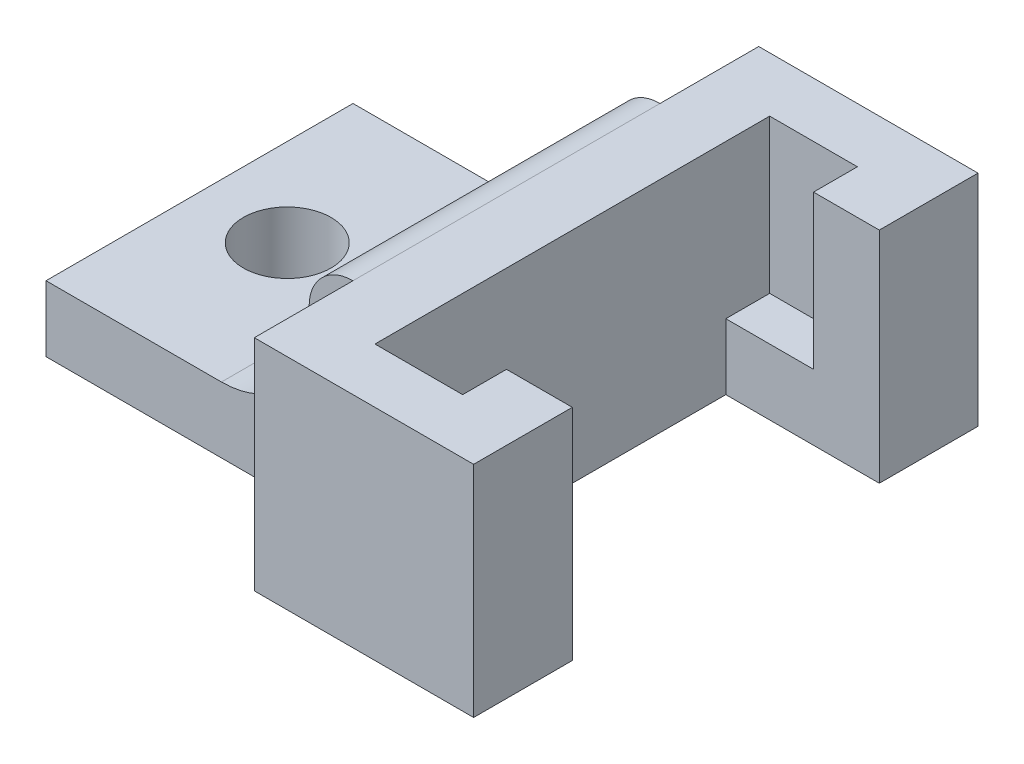
ISO-10303-21;
HEADER;
FILE_DESCRIPTION(('STEP AP214'),'2;1');
FILE_NAME('part.step','',(''),(''),'','','');
FILE_SCHEMA(('AUTOMOTIVE_DESIGN { 1 0 10303 214 1 1 1 1 }'));
ENDSEC;
DATA;
#1=APPLICATION_CONTEXT('core data for automotive mechanical design processes');
#2=APPLICATION_PROTOCOL_DEFINITION('international standard','automotive_design',2000,#1);
#3=PRODUCT_CONTEXT('',#1,'mechanical');
#4=PRODUCT('Part','Part','',(#3));
#5=PRODUCT_RELATED_PRODUCT_CATEGORY('part','',(#4));
#6=PRODUCT_DEFINITION_FORMATION('','',#4);
#7=PRODUCT_DEFINITION_CONTEXT('part definition',#1,'design');
#8=PRODUCT_DEFINITION('design','',#6,#7);
#9=PRODUCT_DEFINITION_SHAPE('','',#8);
#10=(LENGTH_UNIT() NAMED_UNIT(*) SI_UNIT(.MILLI.,.METRE.));
#11=(NAMED_UNIT(*) PLANE_ANGLE_UNIT() SI_UNIT($,.RADIAN.));
#12=(NAMED_UNIT(*) SI_UNIT($,.STERADIAN.) SOLID_ANGLE_UNIT());
#13=UNCERTAINTY_MEASURE_WITH_UNIT(LENGTH_MEASURE(1.E-05),#10,'distance_accuracy_value','');
#14=(GEOMETRIC_REPRESENTATION_CONTEXT(3) GLOBAL_UNCERTAINTY_ASSIGNED_CONTEXT((#13)) GLOBAL_UNIT_ASSIGNED_CONTEXT((#10,
#11,#12)) REPRESENTATION_CONTEXT('',''));
#15=CARTESIAN_POINT('',(0.,0.,0.));
#16=DIRECTION('',(0.,0.,1.));
#17=DIRECTION('',(1.,0.,0.));
#18=AXIS2_PLACEMENT_3D('',#15,#16,#17);
#19=CARTESIAN_POINT('',(0.,0.,0.));
#20=DIRECTION('',(0.,1.,0.));
#21=DIRECTION('',(0.,0.,1.));
#22=AXIS2_PLACEMENT_3D('',#19,#20,#21);
#23=PLANE('',#22);
#24=CARTESIAN_POINT('',(4.,0.,-7.));
#25=DIRECTION('',(0.,1.,0.));
#26=DIRECTION('',(0.,0.,1.));
#27=AXIS2_PLACEMENT_3D('',#24,#25,#26);
#28=CIRCLE('',#27,2.);
#29=CARTESIAN_POINT('',(4.,0.,-5.));
#30=VERTEX_POINT('',#29);
#31=EDGE_CURVE('E301',#30,#30,#28,.T.);
#32=ORIENTED_EDGE('',*,*,#31,.T.);
#33=EDGE_LOOP('',(#32));
#34=FACE_BOUND('',#33,.T.);
#35=DIRECTION('',(1.,0.,0.));
#36=VECTOR('',#35,1.);
#37=CARTESIAN_POINT('',(0.,0.,0.));
#38=LINE('',#37,#36);
#39=CARTESIAN_POINT('',(17.,0.,0.));
#40=VERTEX_POINT('',#39);
#41=CARTESIAN_POINT('',(24.,0.,0.));
#42=VERTEX_POINT('',#41);
#43=EDGE_CURVE('E297',#40,#42,#38,.T.);
#44=ORIENTED_EDGE('',*,*,#43,.T.);
#45=DIRECTION('',(0.,0.,1.));
#46=VECTOR('',#45,1.);
#47=CARTESIAN_POINT('',(24.,0.,0.));
#48=LINE('',#47,#46);
#49=CARTESIAN_POINT('',(24.,0.,4.5));
#50=VERTEX_POINT('',#49);
#51=EDGE_CURVE('E330',#42,#50,#48,.T.);
#52=ORIENTED_EDGE('',*,*,#51,.T.);
#53=DIRECTION('',(1.,0.,0.));
#54=VECTOR('',#53,1.);
#55=CARTESIAN_POINT('',(0.,0.,4.5));
#56=LINE('',#55,#54);
#57=CARTESIAN_POINT('',(14.,0.,4.5));
#58=VERTEX_POINT('',#57);
#59=EDGE_CURVE('E345',#58,#50,#56,.T.);
#60=ORIENTED_EDGE('',*,*,#59,.F.);
#61=DIRECTION('',(0.,0.,1.));
#62=VECTOR('',#61,1.);
#63=CARTESIAN_POINT('',(14.,0.,0.));
#64=LINE('',#63,#62);
#65=CARTESIAN_POINT('',(14.,0.,0.));
#66=VERTEX_POINT('',#65);
#67=EDGE_CURVE('E337',#66,#58,#64,.T.);
#68=ORIENTED_EDGE('',*,*,#67,.F.);
#69=DIRECTION('',(1.,0.,0.));
#70=VECTOR('',#69,1.);
#71=CARTESIAN_POINT('',(0.,0.,0.));
#72=LINE('',#71,#70);
#73=CARTESIAN_POINT('',(0.,0.,0.));
#74=VERTEX_POINT('',#73);
#75=EDGE_CURVE('E343',#74,#66,#72,.T.);
#76=ORIENTED_EDGE('',*,*,#75,.F.);
#77=DIRECTION('',(0.,0.,-1.));
#78=VECTOR('',#77,1.);
#79=CARTESIAN_POINT('',(0.,0.,0.));
#80=LINE('',#79,#78);
#81=CARTESIAN_POINT('',(0.,0.,-14.));
#82=VERTEX_POINT('',#81);
#83=EDGE_CURVE('E340',#74,#82,#80,.T.);
#84=ORIENTED_EDGE('',*,*,#83,.T.);
#85=DIRECTION('',(1.,0.,0.));
#86=VECTOR('',#85,1.);
#87=CARTESIAN_POINT('',(0.,0.,-14.));
#88=LINE('',#87,#86);
#89=CARTESIAN_POINT('',(14.,0.,-14.));
#90=VERTEX_POINT('',#89);
#91=EDGE_CURVE('E336',#82,#90,#88,.T.);
#92=ORIENTED_EDGE('',*,*,#91,.T.);
#93=CARTESIAN_POINT('',(14.,0.,-18.5));
#94=VERTEX_POINT('',#93);
#95=EDGE_CURVE('E333',#94,#90,#64,.T.);
#96=ORIENTED_EDGE('',*,*,#95,.F.);
#97=DIRECTION('',(1.,0.,0.));
#98=VECTOR('',#97,1.);
#99=CARTESIAN_POINT('',(0.,0.,-18.5));
#100=LINE('',#99,#98);
#101=CARTESIAN_POINT('',(24.,0.,-18.5));
#102=VERTEX_POINT('',#101);
#103=EDGE_CURVE('E329',#94,#102,#100,.T.);
#104=ORIENTED_EDGE('',*,*,#103,.T.);
#105=CARTESIAN_POINT('',(24.,0.,-14.));
#106=VERTEX_POINT('',#105);
#107=EDGE_CURVE('E326',#102,#106,#48,.T.);
#108=ORIENTED_EDGE('',*,*,#107,.T.);
#109=DIRECTION('',(1.,0.,0.));
#110=VECTOR('',#109,1.);
#111=CARTESIAN_POINT('',(0.,0.,-14.));
#112=LINE('',#111,#110);
#113=CARTESIAN_POINT('',(17.,0.,-14.));
#114=VERTEX_POINT('',#113);
#115=EDGE_CURVE('E323',#114,#106,#112,.T.);
#116=ORIENTED_EDGE('',*,*,#115,.F.);
#117=DIRECTION('',(0.,0.,1.));
#118=VECTOR('',#117,1.);
#119=CARTESIAN_POINT('',(17.,0.,0.));
#120=LINE('',#119,#118);
#121=EDGE_CURVE('E320',#114,#40,#120,.T.);
#122=ORIENTED_EDGE('',*,*,#121,.T.);
#123=EDGE_LOOP('',(#44,#52,#60,#68,#76,#84,#92,#96,#104,#108,#116,#122));
#124=FACE_BOUND('',#123,.T.);
#125=DIRECTION('',(-1.,0.,0.));
#126=VECTOR('',#125,1.);
#127=CARTESIAN_POINT('',(7.05,0.,-2.5));
#128=LINE('',#127,#126);
#129=CARTESIAN_POINT('',(11.05,0.,-2.5));
#130=VERTEX_POINT('',#129);
#131=CARTESIAN_POINT('',(7.05,0.,-2.5));
#132=VERTEX_POINT('',#131);
#133=EDGE_CURVE('E58',#130,#132,#128,.T.);
#134=ORIENTED_EDGE('',*,*,#133,.F.);
#135=DIRECTION('',(0.,0.,1.));
#136=VECTOR('',#135,1.);
#137=CARTESIAN_POINT('',(11.05,0.,-11.5));
#138=LINE('',#137,#136);
#139=CARTESIAN_POINT('',(11.05,0.,-11.5));
#140=VERTEX_POINT('',#139);
#141=EDGE_CURVE('E402',#130,#140,#138,.F.);
#142=ORIENTED_EDGE('',*,*,#141,.T.);
#143=DIRECTION('',(1.,0.,0.));
#144=VECTOR('',#143,1.);
#145=CARTESIAN_POINT('',(7.05,0.,-11.5));
#146=LINE('',#145,#144);
#147=CARTESIAN_POINT('',(7.05,0.,-11.5));
#148=VERTEX_POINT('',#147);
#149=EDGE_CURVE('E65',#148,#140,#146,.T.);
#150=ORIENTED_EDGE('',*,*,#149,.F.);
#151=DIRECTION('',(0.,0.,-1.));
#152=VECTOR('',#151,1.);
#153=CARTESIAN_POINT('',(7.05,0.,-2.5));
#154=LINE('',#153,#152);
#155=EDGE_CURVE('E407',#132,#148,#154,.T.);
#156=ORIENTED_EDGE('',*,*,#155,.F.);
#157=EDGE_LOOP('',(#134,#142,#150,#156));
#158=FACE_BOUND('',#157,.T.);
#159=ADVANCED_FACE('F43',(#34,#124,#158),#23,.F.);
#160=CARTESIAN_POINT('',(0.,10.,0.));
#161=DIRECTION('',(-1.,0.,0.));
#162=DIRECTION('',(0.,0.,1.));
#163=AXIS2_PLACEMENT_3D('',#160,#161,#162);
#164=PLANE('',#163);
#165=DIRECTION('',(0.,-1.,0.));
#166=VECTOR('',#165,1.);
#167=CARTESIAN_POINT('',(0.,10.,0.));
#168=LINE('',#167,#166);
#169=CARTESIAN_POINT('',(0.,3.,0.));
#170=VERTEX_POINT('',#169);
#171=EDGE_CURVE('E360',#170,#74,#168,.T.);
#172=ORIENTED_EDGE('',*,*,#171,.F.);
#173=DIRECTION('',(0.,0.,1.));
#174=VECTOR('',#173,1.);
#175=CARTESIAN_POINT('',(0.,3.,-14.));
#176=LINE('',#175,#174);
#177=CARTESIAN_POINT('',(0.,3.,-14.));
#178=VERTEX_POINT('',#177);
#179=EDGE_CURVE('E265',#178,#170,#176,.T.);
#180=ORIENTED_EDGE('',*,*,#179,.F.);
#181=DIRECTION('',(0.,-1.,0.));
#182=VECTOR('',#181,1.);
#183=CARTESIAN_POINT('',(0.,10.,-14.));
#184=LINE('',#183,#182);
#185=EDGE_CURVE('E362',#178,#82,#184,.T.);
#186=ORIENTED_EDGE('',*,*,#185,.T.);
#187=ORIENTED_EDGE('',*,*,#83,.F.);
#188=EDGE_LOOP('',(#172,#180,#186,#187));
#189=FACE_BOUND('',#188,.T.);
#190=ADVANCED_FACE('F428',(#189),#164,.T.);
#191=CARTESIAN_POINT('',(4.,10.,-7.));
#192=DIRECTION('',(0.,-1.,0.));
#193=DIRECTION('',(0.,0.,-1.));
#194=AXIS2_PLACEMENT_3D('',#191,#192,#193);
#195=CYLINDRICAL_SURFACE('',#194,2.);
#196=ORIENTED_EDGE('',*,*,#31,.F.);
#197=EDGE_LOOP('',(#196));
#198=FACE_BOUND('',#197,.T.);
#199=CARTESIAN_POINT('',(4.,3.,-7.));
#200=DIRECTION('',(0.,1.,0.));
#201=DIRECTION('',(0.,0.,1.));
#202=AXIS2_PLACEMENT_3D('',#199,#200,#201);
#203=CIRCLE('',#202,2.);
#204=CARTESIAN_POINT('',(4.,3.,-5.));
#205=VERTEX_POINT('',#204);
#206=EDGE_CURVE('E293',#205,#205,#203,.T.);
#207=ORIENTED_EDGE('',*,*,#206,.T.);
#208=EDGE_LOOP('',(#207));
#209=FACE_BOUND('',#208,.T.);
#210=ADVANCED_FACE('F436',(#198,#209),#195,.F.);
#211=CARTESIAN_POINT('',(0.,10.,0.));
#212=DIRECTION('',(0.,0.,-1.));
#213=DIRECTION('',(-1.,0.,0.));
#214=AXIS2_PLACEMENT_3D('',#211,#212,#213);
#215=PLANE('',#214);
#216=DIRECTION('',(0.,-1.,0.));
#217=VECTOR('',#216,1.);
#218=CARTESIAN_POINT('',(21.,10.,0.));
#219=LINE('',#218,#217);
#220=CARTESIAN_POINT('',(21.,10.,0.));
#221=VERTEX_POINT('',#220);
#222=CARTESIAN_POINT('',(21.,3.,0.));
#223=VERTEX_POINT('',#222);
#224=EDGE_CURVE('E291',#221,#223,#219,.T.);
#225=ORIENTED_EDGE('',*,*,#224,.F.);
#226=DIRECTION('',(1.,0.,0.));
#227=VECTOR('',#226,1.);
#228=CARTESIAN_POINT('',(0.,10.,0.));
#229=LINE('',#228,#227);
#230=CARTESIAN_POINT('',(24.,10.,0.));
#231=VERTEX_POINT('',#230);
#232=EDGE_CURVE('E298',#221,#231,#229,.T.);
#233=ORIENTED_EDGE('',*,*,#232,.T.);
#234=DIRECTION('',(0.,-1.,0.));
#235=VECTOR('',#234,1.);
#236=CARTESIAN_POINT('',(24.,10.,0.));
#237=LINE('',#236,#235);
#238=EDGE_CURVE('E350',#231,#42,#237,.T.);
#239=ORIENTED_EDGE('',*,*,#238,.T.);
#240=ORIENTED_EDGE('',*,*,#43,.F.);
#241=DIRECTION('',(0.,-1.,0.));
#242=VECTOR('',#241,1.);
#243=CARTESIAN_POINT('',(17.,10.,0.));
#244=LINE('',#243,#242);
#245=CARTESIAN_POINT('',(17.,3.,0.));
#246=VERTEX_POINT('',#245);
#247=EDGE_CURVE('E374',#246,#40,#244,.T.);
#248=ORIENTED_EDGE('',*,*,#247,.F.);
#249=DIRECTION('',(1.,0.,0.));
#250=VECTOR('',#249,1.);
#251=CARTESIAN_POINT('',(0.,3.,0.));
#252=LINE('',#251,#250);
#253=EDGE_CURVE('E294',#246,#223,#252,.T.);
#254=ORIENTED_EDGE('',*,*,#253,.T.);
#255=EDGE_LOOP('',(#225,#233,#239,#240,#248,#254));
#256=FACE_BOUND('',#255,.T.);
#257=ADVANCED_FACE('F446',(#256),#215,.T.);
#258=CARTESIAN_POINT('',(17.,10.,0.));
#259=DIRECTION('',(1.,0.,0.));
#260=DIRECTION('',(0.,0.,-1.));
#261=AXIS2_PLACEMENT_3D('',#258,#259,#260);
#262=PLANE('',#261);
#263=DIRECTION('',(0.,0.,1.));
#264=VECTOR('',#263,1.);
#265=CARTESIAN_POINT('',(17.,10.,0.));
#266=LINE('',#265,#264);
#267=CARTESIAN_POINT('',(17.,10.,-16.));
#268=VERTEX_POINT('',#267);
#269=CARTESIAN_POINT('',(17.,10.,2.));
#270=VERTEX_POINT('',#269);
#271=EDGE_CURVE('E300',#268,#270,#266,.T.);
#272=ORIENTED_EDGE('',*,*,#271,.T.);
#273=DIRECTION('',(0.,1.,0.));
#274=VECTOR('',#273,1.);
#275=CARTESIAN_POINT('',(17.,3.,2.));
#276=LINE('',#275,#274);
#277=CARTESIAN_POINT('',(17.,3.,2.));
#278=VERTEX_POINT('',#277);
#279=EDGE_CURVE('E274',#278,#270,#276,.T.);
#280=ORIENTED_EDGE('',*,*,#279,.F.);
#281=DIRECTION('',(0.,0.,1.));
#282=VECTOR('',#281,1.);
#283=CARTESIAN_POINT('',(17.,3.,-16.));
#284=LINE('',#283,#282);
#285=EDGE_CURVE('E255',#246,#278,#284,.T.);
#286=ORIENTED_EDGE('',*,*,#285,.F.);
#287=ORIENTED_EDGE('',*,*,#247,.T.);
#288=ORIENTED_EDGE('',*,*,#121,.F.);
#289=DIRECTION('',(0.,-1.,0.));
#290=VECTOR('',#289,1.);
#291=CARTESIAN_POINT('',(17.,10.,-14.));
#292=LINE('',#291,#290);
#293=CARTESIAN_POINT('',(17.,3.,-14.));
#294=VERTEX_POINT('',#293);
#295=EDGE_CURVE('E372',#294,#114,#292,.T.);
#296=ORIENTED_EDGE('',*,*,#295,.F.);
#297=CARTESIAN_POINT('',(17.,3.,-16.));
#298=VERTEX_POINT('',#297);
#299=EDGE_CURVE('E256',#298,#294,#284,.T.);
#300=ORIENTED_EDGE('',*,*,#299,.F.);
#301=DIRECTION('',(0.,1.,0.));
#302=VECTOR('',#301,1.);
#303=CARTESIAN_POINT('',(17.,3.,-16.));
#304=LINE('',#303,#302);
#305=EDGE_CURVE('E277',#298,#268,#304,.T.);
#306=ORIENTED_EDGE('',*,*,#305,.T.);
#307=EDGE_LOOP('',(#272,#280,#286,#287,#288,#296,#300,#306));
#308=FACE_BOUND('',#307,.T.);
#309=ADVANCED_FACE('F477',(#308),#262,.T.);
#310=CARTESIAN_POINT('',(0.,10.,-14.));
#311=DIRECTION('',(0.,0.,-1.));
#312=DIRECTION('',(-1.,0.,0.));
#313=AXIS2_PLACEMENT_3D('',#310,#311,#312);
#314=PLANE('',#313);
#315=DIRECTION('',(1.,0.,0.));
#316=VECTOR('',#315,1.);
#317=CARTESIAN_POINT('',(0.,10.,-14.));
#318=LINE('',#317,#316);
#319=CARTESIAN_POINT('',(21.,10.,-14.));
#320=VERTEX_POINT('',#319);
#321=CARTESIAN_POINT('',(24.,10.,-14.));
#322=VERTEX_POINT('',#321);
#323=EDGE_CURVE('E303',#320,#322,#318,.T.);
#324=ORIENTED_EDGE('',*,*,#323,.F.);
#325=DIRECTION('',(0.,-1.,0.));
#326=VECTOR('',#325,1.);
#327=CARTESIAN_POINT('',(21.,10.,-14.));
#328=LINE('',#327,#326);
#329=CARTESIAN_POINT('',(21.,3.,-14.));
#330=VERTEX_POINT('',#329);
#331=EDGE_CURVE('E273',#320,#330,#328,.T.);
#332=ORIENTED_EDGE('',*,*,#331,.T.);
#333=DIRECTION('',(1.,0.,0.));
#334=VECTOR('',#333,1.);
#335=CARTESIAN_POINT('',(0.,3.,-14.));
#336=LINE('',#335,#334);
#337=EDGE_CURVE('E379',#294,#330,#336,.T.);
#338=ORIENTED_EDGE('',*,*,#337,.F.);
#339=ORIENTED_EDGE('',*,*,#295,.T.);
#340=ORIENTED_EDGE('',*,*,#115,.T.);
#341=DIRECTION('',(0.,-1.,0.));
#342=VECTOR('',#341,1.);
#343=CARTESIAN_POINT('',(24.,10.,-14.));
#344=LINE('',#343,#342);
#345=EDGE_CURVE('E370',#322,#106,#344,.T.);
#346=ORIENTED_EDGE('',*,*,#345,.F.);
#347=EDGE_LOOP('',(#324,#332,#338,#339,#340,#346));
#348=FACE_BOUND('',#347,.T.);
#349=ADVANCED_FACE('F474',(#348),#314,.F.);
#350=CARTESIAN_POINT('',(24.,10.,0.));
#351=DIRECTION('',(1.,0.,0.));
#352=DIRECTION('',(0.,0.,-1.));
#353=AXIS2_PLACEMENT_3D('',#350,#351,#352);
#354=PLANE('',#353);
#355=ORIENTED_EDGE('',*,*,#107,.F.);
#356=DIRECTION('',(0.,-1.,0.));
#357=VECTOR('',#356,1.);
#358=CARTESIAN_POINT('',(24.,10.,-18.5));
#359=LINE('',#358,#357);
#360=CARTESIAN_POINT('',(24.,10.,-18.5));
#361=VERTEX_POINT('',#360);
#362=EDGE_CURVE('E368',#361,#102,#359,.T.);
#363=ORIENTED_EDGE('',*,*,#362,.F.);
#364=DIRECTION('',(0.,0.,1.));
#365=VECTOR('',#364,1.);
#366=CARTESIAN_POINT('',(24.,10.,0.));
#367=LINE('',#366,#365);
#368=EDGE_CURVE('E305',#361,#322,#367,.T.);
#369=ORIENTED_EDGE('',*,*,#368,.T.);
#370=ORIENTED_EDGE('',*,*,#345,.T.);
#371=EDGE_LOOP('',(#355,#363,#369,#370));
#372=FACE_BOUND('',#371,.T.);
#373=ADVANCED_FACE('F453',(#372),#354,.T.);
#374=CARTESIAN_POINT('',(0.,10.,-18.5));
#375=DIRECTION('',(0.,0.,-1.));
#376=DIRECTION('',(-1.,0.,0.));
#377=AXIS2_PLACEMENT_3D('',#374,#375,#376);
#378=PLANE('',#377);
#379=ORIENTED_EDGE('',*,*,#103,.F.);
#380=DIRECTION('',(0.,-1.,0.));
#381=VECTOR('',#380,1.);
#382=CARTESIAN_POINT('',(14.,10.,-18.5));
#383=LINE('',#382,#381);
#384=CARTESIAN_POINT('',(14.,10.,-18.5));
#385=VERTEX_POINT('',#384);
#386=EDGE_CURVE('E366',#385,#94,#383,.T.);
#387=ORIENTED_EDGE('',*,*,#386,.F.);
#388=DIRECTION('',(1.,0.,0.));
#389=VECTOR('',#388,1.);
#390=CARTESIAN_POINT('',(0.,10.,-18.5));
#391=LINE('',#390,#389);
#392=EDGE_CURVE('E308',#385,#361,#391,.T.);
#393=ORIENTED_EDGE('',*,*,#392,.T.);
#394=ORIENTED_EDGE('',*,*,#362,.T.);
#395=EDGE_LOOP('',(#379,#387,#393,#394));
#396=FACE_BOUND('',#395,.T.);
#397=ADVANCED_FACE('F470',(#396),#378,.T.);
#398=CARTESIAN_POINT('',(14.,10.,0.));
#399=DIRECTION('',(1.,0.,0.));
#400=DIRECTION('',(0.,0.,-1.));
#401=AXIS2_PLACEMENT_3D('',#398,#399,#400);
#402=PLANE('',#401);
#403=ORIENTED_EDGE('',*,*,#95,.T.);
#404=DIRECTION('',(0.,-1.,0.));
#405=VECTOR('',#404,1.);
#406=CARTESIAN_POINT('',(14.,10.,-14.));
#407=LINE('',#406,#405);
#408=CARTESIAN_POINT('',(14.,10.,-14.));
#409=VERTEX_POINT('',#408);
#410=EDGE_CURVE('E364',#409,#90,#407,.T.);
#411=ORIENTED_EDGE('',*,*,#410,.F.);
#412=DIRECTION('',(0.,0.,1.));
#413=VECTOR('',#412,1.);
#414=CARTESIAN_POINT('',(14.,10.,0.));
#415=LINE('',#414,#413);
#416=EDGE_CURVE('E312',#385,#409,#415,.T.);
#417=ORIENTED_EDGE('',*,*,#416,.F.);
#418=ORIENTED_EDGE('',*,*,#386,.T.);
#419=EDGE_LOOP('',(#403,#411,#417,#418));
#420=FACE_BOUND('',#419,.T.);
#421=ADVANCED_FACE('F462',(#420),#402,.F.);
#422=CARTESIAN_POINT('',(0.,10.,-14.));
#423=DIRECTION('',(0.,0.,-1.));
#424=DIRECTION('',(-1.,0.,0.));
#425=AXIS2_PLACEMENT_3D('',#422,#423,#424);
#426=PLANE('',#425);
#427=DIRECTION('',(0.,1.,0.));
#428=VECTOR('',#427,1.);
#429=CARTESIAN_POINT('',(12.,3.,-14.));
#430=LINE('',#429,#428);
#431=CARTESIAN_POINT('',(12.,7.,-14.));
#432=VERTEX_POINT('',#431);
#433=CARTESIAN_POINT('',(12.,8.,-14.));
#434=VERTEX_POINT('',#433);
#435=EDGE_CURVE('E239',#432,#434,#430,.T.);
#436=ORIENTED_EDGE('',*,*,#435,.T.);
#437=CARTESIAN_POINT('',(14.,8.,-14.));
#438=DIRECTION('',(0.,0.,-1.));
#439=DIRECTION('',(-1.,0.,0.));
#440=AXIS2_PLACEMENT_3D('',#437,#438,#439);
#441=CIRCLE('',#440,2.);
#442=EDGE_CURVE('E395',#434,#409,#441,.T.);
#443=ORIENTED_EDGE('',*,*,#442,.T.);
#444=ORIENTED_EDGE('',*,*,#410,.T.);
#445=ORIENTED_EDGE('',*,*,#91,.F.);
#446=ORIENTED_EDGE('',*,*,#185,.F.);
#447=DIRECTION('',(-1.,0.,0.));
#448=VECTOR('',#447,1.);
#449=CARTESIAN_POINT('',(0.,3.,-14.));
#450=LINE('',#449,#448);
#451=CARTESIAN_POINT('',(8.,3.,-14.));
#452=VERTEX_POINT('',#451);
#453=EDGE_CURVE('E282',#452,#178,#450,.T.);
#454=ORIENTED_EDGE('',*,*,#453,.F.);
#455=CARTESIAN_POINT('',(8.,7.,-14.));
#456=DIRECTION('',(0.,0.,-1.));
#457=DIRECTION('',(-1.,0.,0.));
#458=AXIS2_PLACEMENT_3D('',#455,#456,#457);
#459=CIRCLE('',#458,4.);
#460=EDGE_CURVE('E388',#452,#432,#459,.F.);
#461=ORIENTED_EDGE('',*,*,#460,.T.);
#462=EDGE_LOOP('',(#436,#443,#444,#445,#446,#454,#461));
#463=FACE_BOUND('',#462,.T.);
#464=ADVANCED_FACE('F464',(#463),#426,.T.);
#465=CARTESIAN_POINT('',(0.,10.,0.));
#466=DIRECTION('',(0.,0.,-1.));
#467=DIRECTION('',(-1.,0.,0.));
#468=AXIS2_PLACEMENT_3D('',#465,#466,#467);
#469=PLANE('',#468);
#470=DIRECTION('',(0.,-1.,0.));
#471=VECTOR('',#470,1.);
#472=CARTESIAN_POINT('',(14.,10.,0.));
#473=LINE('',#472,#471);
#474=CARTESIAN_POINT('',(14.,10.,0.));
#475=VERTEX_POINT('',#474);
#476=EDGE_CURVE('E357',#475,#66,#473,.T.);
#477=ORIENTED_EDGE('',*,*,#476,.F.);
#478=CARTESIAN_POINT('',(14.,8.,0.));
#479=DIRECTION('',(0.,0.,-1.));
#480=DIRECTION('',(-1.,0.,0.));
#481=AXIS2_PLACEMENT_3D('',#478,#479,#480);
#482=CIRCLE('',#481,2.);
#483=CARTESIAN_POINT('',(12.,8.,0.));
#484=VERTEX_POINT('',#483);
#485=EDGE_CURVE('E399',#475,#484,#482,.F.);
#486=ORIENTED_EDGE('',*,*,#485,.T.);
#487=DIRECTION('',(0.,1.,0.));
#488=VECTOR('',#487,1.);
#489=CARTESIAN_POINT('',(12.,3.,0.));
#490=LINE('',#489,#488);
#491=CARTESIAN_POINT('',(12.,7.,0.));
#492=VERTEX_POINT('',#491);
#493=EDGE_CURVE('E242',#492,#484,#490,.T.);
#494=ORIENTED_EDGE('',*,*,#493,.F.);
#495=CARTESIAN_POINT('',(8.,7.,0.));
#496=DIRECTION('',(0.,0.,-1.));
#497=DIRECTION('',(-1.,0.,0.));
#498=AXIS2_PLACEMENT_3D('',#495,#496,#497);
#499=CIRCLE('',#498,4.);
#500=CARTESIAN_POINT('',(8.,3.,0.));
#501=VERTEX_POINT('',#500);
#502=EDGE_CURVE('E390',#492,#501,#499,.T.);
#503=ORIENTED_EDGE('',*,*,#502,.T.);
#504=DIRECTION('',(1.,0.,0.));
#505=VECTOR('',#504,1.);
#506=CARTESIAN_POINT('',(0.,3.,0.));
#507=LINE('',#506,#505);
#508=EDGE_CURVE('E285',#170,#501,#507,.T.);
#509=ORIENTED_EDGE('',*,*,#508,.F.);
#510=ORIENTED_EDGE('',*,*,#171,.T.);
#511=ORIENTED_EDGE('',*,*,#75,.T.);
#512=EDGE_LOOP('',(#477,#486,#494,#503,#509,#510,#511));
#513=FACE_BOUND('',#512,.T.);
#514=ADVANCED_FACE('F460',(#513),#469,.F.);
#515=ORIENTED_EDGE('',*,*,#67,.T.);
#516=DIRECTION('',(0.,-1.,0.));
#517=VECTOR('',#516,1.);
#518=CARTESIAN_POINT('',(14.,10.,4.5));
#519=LINE('',#518,#517);
#520=CARTESIAN_POINT('',(14.,10.,4.5));
#521=VERTEX_POINT('',#520);
#522=EDGE_CURVE('E354',#521,#58,#519,.T.);
#523=ORIENTED_EDGE('',*,*,#522,.F.);
#524=EDGE_CURVE('E315',#475,#521,#415,.T.);
#525=ORIENTED_EDGE('',*,*,#524,.F.);
#526=ORIENTED_EDGE('',*,*,#476,.T.);
#527=EDGE_LOOP('',(#515,#523,#525,#526));
#528=FACE_BOUND('',#527,.T.);
#529=ADVANCED_FACE('F456',(#528),#402,.F.);
#530=CARTESIAN_POINT('',(0.,10.,4.5));
#531=DIRECTION('',(0.,0.,-1.));
#532=DIRECTION('',(-1.,0.,0.));
#533=AXIS2_PLACEMENT_3D('',#530,#531,#532);
#534=PLANE('',#533);
#535=ORIENTED_EDGE('',*,*,#59,.T.);
#536=DIRECTION('',(0.,-1.,0.));
#537=VECTOR('',#536,1.);
#538=CARTESIAN_POINT('',(24.,10.,4.5));
#539=LINE('',#538,#537);
#540=CARTESIAN_POINT('',(24.,10.,4.5));
#541=VERTEX_POINT('',#540);
#542=EDGE_CURVE('E352',#541,#50,#539,.T.);
#543=ORIENTED_EDGE('',*,*,#542,.F.);
#544=DIRECTION('',(1.,0.,0.));
#545=VECTOR('',#544,1.);
#546=CARTESIAN_POINT('',(0.,10.,4.5));
#547=LINE('',#546,#545);
#548=EDGE_CURVE('E316',#521,#541,#547,.T.);
#549=ORIENTED_EDGE('',*,*,#548,.F.);
#550=ORIENTED_EDGE('',*,*,#522,.T.);
#551=EDGE_LOOP('',(#535,#543,#549,#550));
#552=FACE_BOUND('',#551,.T.);
#553=ADVANCED_FACE('F451',(#552),#534,.F.);
#554=ORIENTED_EDGE('',*,*,#51,.F.);
#555=ORIENTED_EDGE('',*,*,#238,.F.);
#556=EDGE_CURVE('E309',#231,#541,#367,.T.);
#557=ORIENTED_EDGE('',*,*,#556,.T.);
#558=ORIENTED_EDGE('',*,*,#542,.T.);
#559=EDGE_LOOP('',(#554,#555,#557,#558));
#560=FACE_BOUND('',#559,.T.);
#561=ADVANCED_FACE('F448',(#560),#354,.T.);
#562=CARTESIAN_POINT('',(0.,10.,0.));
#563=DIRECTION('',(0.,1.,0.));
#564=DIRECTION('',(0.,0.,1.));
#565=AXIS2_PLACEMENT_3D('',#562,#563,#564);
#566=PLANE('',#565);
#567=ORIENTED_EDGE('',*,*,#416,.T.);
#568=DIRECTION('',(0.,0.,-1.));
#569=VECTOR('',#568,1.);
#570=CARTESIAN_POINT('',(14.,10.,0.));
#571=LINE('',#570,#569);
#572=EDGE_CURVE('E397',#409,#475,#571,.F.);
#573=ORIENTED_EDGE('',*,*,#572,.T.);
#574=ORIENTED_EDGE('',*,*,#524,.T.);
#575=ORIENTED_EDGE('',*,*,#548,.T.);
#576=ORIENTED_EDGE('',*,*,#556,.F.);
#577=ORIENTED_EDGE('',*,*,#232,.F.);
#578=DIRECTION('',(0.,0.,-1.));
#579=VECTOR('',#578,1.);
#580=CARTESIAN_POINT('',(21.,10.,-16.));
#581=LINE('',#580,#579);
#582=CARTESIAN_POINT('',(21.,10.,2.));
#583=VERTEX_POINT('',#582);
#584=EDGE_CURVE('E262',#583,#221,#581,.T.);
#585=ORIENTED_EDGE('',*,*,#584,.F.);
#586=DIRECTION('',(1.,0.,0.));
#587=VECTOR('',#586,1.);
#588=CARTESIAN_POINT('',(17.,10.,2.));
#589=LINE('',#588,#587);
#590=EDGE_CURVE('E268',#270,#583,#589,.T.);
#591=ORIENTED_EDGE('',*,*,#590,.F.);
#592=ORIENTED_EDGE('',*,*,#271,.F.);
#593=DIRECTION('',(-1.,0.,0.));
#594=VECTOR('',#593,1.);
#595=CARTESIAN_POINT('',(17.,10.,-16.));
#596=LINE('',#595,#594);
#597=CARTESIAN_POINT('',(21.,10.,-16.));
#598=VERTEX_POINT('',#597);
#599=EDGE_CURVE('E264',#598,#268,#596,.T.);
#600=ORIENTED_EDGE('',*,*,#599,.F.);
#601=DIRECTION('',(0.,0.,-1.));
#602=VECTOR('',#601,1.);
#603=CARTESIAN_POINT('',(21.,10.,0.));
#604=LINE('',#603,#602);
#605=EDGE_CURVE('E376',#320,#598,#604,.T.);
#606=ORIENTED_EDGE('',*,*,#605,.F.);
#607=ORIENTED_EDGE('',*,*,#323,.T.);
#608=ORIENTED_EDGE('',*,*,#368,.F.);
#609=ORIENTED_EDGE('',*,*,#392,.F.);
#610=EDGE_LOOP('',(#567,#573,#574,#575,#576,#577,#585,#591,#592,#600,#606,#607,#608,#609));
#611=FACE_BOUND('',#610,.T.);
#612=ADVANCED_FACE('F442',(#611),#566,.T.);
#613=CARTESIAN_POINT('',(12.,3.,-14.));
#614=DIRECTION('',(1.,0.,0.));
#615=DIRECTION('',(0.,0.,-1.));
#616=AXIS2_PLACEMENT_3D('',#613,#614,#615);
#617=PLANE('',#616);
#618=ORIENTED_EDGE('',*,*,#493,.T.);
#619=DIRECTION('',(0.,0.,-1.));
#620=VECTOR('',#619,1.);
#621=CARTESIAN_POINT('',(12.,8.,-14.));
#622=LINE('',#621,#620);
#623=EDGE_CURVE('E392',#484,#434,#622,.T.);
#624=ORIENTED_EDGE('',*,*,#623,.T.);
#625=ORIENTED_EDGE('',*,*,#435,.F.);
#626=DIRECTION('',(0.,0.,-1.));
#627=VECTOR('',#626,1.);
#628=CARTESIAN_POINT('',(12.,7.,-14.));
#629=LINE('',#628,#627);
#630=EDGE_CURVE('E386',#432,#492,#629,.F.);
#631=ORIENTED_EDGE('',*,*,#630,.T.);
#632=EDGE_LOOP('',(#618,#624,#625,#631));
#633=FACE_BOUND('',#632,.T.);
#634=ADVANCED_FACE('F505',(#633),#617,.F.);
#635=CARTESIAN_POINT('',(0.,3.,0.));
#636=DIRECTION('',(0.,1.,0.));
#637=DIRECTION('',(0.,0.,1.));
#638=AXIS2_PLACEMENT_3D('',#635,#636,#637);
#639=PLANE('',#638);
#640=ORIENTED_EDGE('',*,*,#206,.F.);
#641=EDGE_LOOP('',(#640));
#642=FACE_BOUND('',#641,.T.);
#643=ORIENTED_EDGE('',*,*,#508,.T.);
#644=DIRECTION('',(0.,0.,-1.));
#645=VECTOR('',#644,1.);
#646=CARTESIAN_POINT('',(8.,3.,0.));
#647=LINE('',#646,#645);
#648=EDGE_CURVE('E383',#501,#452,#647,.T.);
#649=ORIENTED_EDGE('',*,*,#648,.T.);
#650=ORIENTED_EDGE('',*,*,#453,.T.);
#651=ORIENTED_EDGE('',*,*,#179,.T.);
#652=EDGE_LOOP('',(#643,#649,#650,#651));
#653=FACE_BOUND('',#652,.T.);
#654=ADVANCED_FACE('F512',(#642,#653),#639,.T.);
#655=CARTESIAN_POINT('',(17.,3.,-16.));
#656=DIRECTION('',(0.,0.,-1.));
#657=DIRECTION('',(-1.,0.,0.));
#658=AXIS2_PLACEMENT_3D('',#655,#656,#657);
#659=PLANE('',#658);
#660=ORIENTED_EDGE('',*,*,#599,.T.);
#661=ORIENTED_EDGE('',*,*,#305,.F.);
#662=DIRECTION('',(-1.,0.,0.));
#663=VECTOR('',#662,1.);
#664=CARTESIAN_POINT('',(17.,3.,-16.));
#665=LINE('',#664,#663);
#666=CARTESIAN_POINT('',(21.,3.,-16.));
#667=VERTEX_POINT('',#666);
#668=EDGE_CURVE('E251',#667,#298,#665,.T.);
#669=ORIENTED_EDGE('',*,*,#668,.F.);
#670=DIRECTION('',(0.,1.,0.));
#671=VECTOR('',#670,1.);
#672=CARTESIAN_POINT('',(21.,3.,-16.));
#673=LINE('',#672,#671);
#674=EDGE_CURVE('E261',#667,#598,#673,.T.);
#675=ORIENTED_EDGE('',*,*,#674,.T.);
#676=EDGE_LOOP('',(#660,#661,#669,#675));
#677=FACE_BOUND('',#676,.T.);
#678=ADVANCED_FACE('F563',(#677),#659,.F.);
#679=CARTESIAN_POINT('',(21.,3.,-16.));
#680=DIRECTION('',(1.,0.,0.));
#681=DIRECTION('',(0.,0.,-1.));
#682=AXIS2_PLACEMENT_3D('',#679,#680,#681);
#683=PLANE('',#682);
#684=ORIENTED_EDGE('',*,*,#605,.T.);
#685=ORIENTED_EDGE('',*,*,#674,.F.);
#686=DIRECTION('',(0.,0.,-1.));
#687=VECTOR('',#686,1.);
#688=CARTESIAN_POINT('',(21.,3.,-16.));
#689=LINE('',#688,#687);
#690=EDGE_CURVE('E252',#330,#667,#689,.T.);
#691=ORIENTED_EDGE('',*,*,#690,.F.);
#692=ORIENTED_EDGE('',*,*,#331,.F.);
#693=EDGE_LOOP('',(#684,#685,#691,#692));
#694=FACE_BOUND('',#693,.T.);
#695=ADVANCED_FACE('F567',(#694),#683,.F.);
#696=CARTESIAN_POINT('',(0.,3.,0.));
#697=DIRECTION('',(0.,1.,0.));
#698=DIRECTION('',(0.,0.,1.));
#699=AXIS2_PLACEMENT_3D('',#696,#697,#698);
#700=PLANE('',#699);
#701=ORIENTED_EDGE('',*,*,#337,.T.);
#702=ORIENTED_EDGE('',*,*,#690,.T.);
#703=ORIENTED_EDGE('',*,*,#668,.T.);
#704=ORIENTED_EDGE('',*,*,#299,.T.);
#705=EDGE_LOOP('',(#701,#702,#703,#704));
#706=FACE_BOUND('',#705,.T.);
#707=ADVANCED_FACE('F571',(#706),#700,.T.);
#708=ORIENTED_EDGE('',*,*,#224,.T.);
#709=CARTESIAN_POINT('',(21.,3.,2.));
#710=VERTEX_POINT('',#709);
#711=EDGE_CURVE('E248',#710,#223,#689,.T.);
#712=ORIENTED_EDGE('',*,*,#711,.F.);
#713=DIRECTION('',(0.,1.,0.));
#714=VECTOR('',#713,1.);
#715=CARTESIAN_POINT('',(21.,3.,2.));
#716=LINE('',#715,#714);
#717=EDGE_CURVE('E271',#710,#583,#716,.T.);
#718=ORIENTED_EDGE('',*,*,#717,.T.);
#719=ORIENTED_EDGE('',*,*,#584,.T.);
#720=EDGE_LOOP('',(#708,#712,#718,#719));
#721=FACE_BOUND('',#720,.T.);
#722=ADVANCED_FACE('F554',(#721),#683,.F.);
#723=CARTESIAN_POINT('',(17.,3.,2.));
#724=DIRECTION('',(0.,0.,1.));
#725=DIRECTION('',(1.,0.,0.));
#726=AXIS2_PLACEMENT_3D('',#723,#724,#725);
#727=PLANE('',#726);
#728=ORIENTED_EDGE('',*,*,#590,.T.);
#729=ORIENTED_EDGE('',*,*,#717,.F.);
#730=DIRECTION('',(1.,0.,0.));
#731=VECTOR('',#730,1.);
#732=CARTESIAN_POINT('',(17.,3.,2.));
#733=LINE('',#732,#731);
#734=EDGE_CURVE('E258',#278,#710,#733,.T.);
#735=ORIENTED_EDGE('',*,*,#734,.F.);
#736=ORIENTED_EDGE('',*,*,#279,.T.);
#737=EDGE_LOOP('',(#728,#729,#735,#736));
#738=FACE_BOUND('',#737,.T.);
#739=ADVANCED_FACE('F558',(#738),#727,.F.);
#740=ORIENTED_EDGE('',*,*,#285,.T.);
#741=ORIENTED_EDGE('',*,*,#734,.T.);
#742=ORIENTED_EDGE('',*,*,#711,.T.);
#743=ORIENTED_EDGE('',*,*,#253,.F.);
#744=EDGE_LOOP('',(#740,#741,#742,#743));
#745=FACE_BOUND('',#744,.T.);
#746=ADVANCED_FACE('F488',(#745),#700,.T.);
#747=CARTESIAN_POINT('',(8.,7.,0.));
#748=DIRECTION('',(0.,0.,-1.));
#749=DIRECTION('',(-1.,0.,0.));
#750=AXIS2_PLACEMENT_3D('',#747,#748,#749);
#751=CYLINDRICAL_SURFACE('',#750,4.);
#752=ORIENTED_EDGE('',*,*,#502,.F.);
#753=ORIENTED_EDGE('',*,*,#630,.F.);
#754=ORIENTED_EDGE('',*,*,#460,.F.);
#755=ORIENTED_EDGE('',*,*,#648,.F.);
#756=EDGE_LOOP('',(#752,#753,#754,#755));
#757=FACE_BOUND('',#756,.T.);
#758=ADVANCED_FACE('F485',(#757),#751,.F.);
#759=CARTESIAN_POINT('',(14.,8.,-14.));
#760=DIRECTION('',(0.,0.,1.));
#761=DIRECTION('',(1.,0.,0.));
#762=AXIS2_PLACEMENT_3D('',#759,#760,#761);
#763=CYLINDRICAL_SURFACE('',#762,2.);
#764=ORIENTED_EDGE('',*,*,#485,.F.);
#765=ORIENTED_EDGE('',*,*,#572,.F.);
#766=ORIENTED_EDGE('',*,*,#442,.F.);
#767=ORIENTED_EDGE('',*,*,#623,.F.);
#768=EDGE_LOOP('',(#764,#765,#766,#767));
#769=FACE_BOUND('',#768,.T.);
#770=ADVANCED_FACE('F487',(#769),#763,.T.);
#771=CARTESIAN_POINT('',(9.05,-4.,-2.5));
#772=DIRECTION('',(-1.,0.,0.));
#773=DIRECTION('',(0.,0.,1.));
#774=AXIS2_PLACEMENT_3D('',#771,#772,#773);
#775=PLANE('',#774);
#776=DIRECTION('',(0.,1.,0.));
#777=VECTOR('',#776,1.);
#778=CARTESIAN_POINT('',(9.05,-4.,-11.5));
#779=LINE('',#778,#777);
#780=CARTESIAN_POINT('',(9.05,-4.,-11.5));
#781=VERTEX_POINT('',#780);
#782=CARTESIAN_POINT('',(9.05,-2.,-11.5));
#783=VERTEX_POINT('',#782);
#784=EDGE_CURVE('E414',#781,#783,#779,.T.);
#785=ORIENTED_EDGE('',*,*,#784,.T.);
#786=DIRECTION('',(0.,0.,1.));
#787=VECTOR('',#786,1.);
#788=CARTESIAN_POINT('',(9.05,-2.,-2.5));
#789=LINE('',#788,#787);
#790=CARTESIAN_POINT('',(9.05,-2.,-2.5));
#791=VERTEX_POINT('',#790);
#792=EDGE_CURVE('E238',#783,#791,#789,.T.);
#793=ORIENTED_EDGE('',*,*,#792,.T.);
#794=DIRECTION('',(0.,1.,0.));
#795=VECTOR('',#794,1.);
#796=CARTESIAN_POINT('',(9.05,-4.,-2.5));
#797=LINE('',#796,#795);
#798=CARTESIAN_POINT('',(9.05,-4.,-2.5));
#799=VERTEX_POINT('',#798);
#800=EDGE_CURVE('E219',#799,#791,#797,.T.);
#801=ORIENTED_EDGE('',*,*,#800,.F.);
#802=DIRECTION('',(0.,0.,1.));
#803=VECTOR('',#802,1.);
#804=CARTESIAN_POINT('',(9.05,-4.,-2.5));
#805=LINE('',#804,#803);
#806=EDGE_CURVE('E225',#781,#799,#805,.T.);
#807=ORIENTED_EDGE('',*,*,#806,.F.);
#808=EDGE_LOOP('',(#785,#793,#801,#807));
#809=FACE_BOUND('',#808,.T.);
#810=ADVANCED_FACE('F236',(#809),#775,.F.);
#811=CARTESIAN_POINT('',(7.05,-4.,-2.5));
#812=DIRECTION('',(0.,0.,-1.));
#813=DIRECTION('',(-1.,0.,0.));
#814=AXIS2_PLACEMENT_3D('',#811,#812,#813);
#815=PLANE('',#814);
#816=ORIENTED_EDGE('',*,*,#133,.T.);
#817=DIRECTION('',(0.,1.,0.));
#818=VECTOR('',#817,1.);
#819=CARTESIAN_POINT('',(7.05,-4.,-2.5));
#820=LINE('',#819,#818);
#821=CARTESIAN_POINT('',(7.05,-4.,-2.5));
#822=VERTEX_POINT('',#821);
#823=EDGE_CURVE('E221',#822,#132,#820,.T.);
#824=ORIENTED_EDGE('',*,*,#823,.F.);
#825=DIRECTION('',(-1.,0.,0.));
#826=VECTOR('',#825,1.);
#827=CARTESIAN_POINT('',(7.05,-4.,-2.5));
#828=LINE('',#827,#826);
#829=EDGE_CURVE('E215',#799,#822,#828,.T.);
#830=ORIENTED_EDGE('',*,*,#829,.F.);
#831=ORIENTED_EDGE('',*,*,#800,.T.);
#832=CARTESIAN_POINT('',(11.05,-2.,-2.5));
#833=DIRECTION('',(0.,0.,-1.));
#834=DIRECTION('',(-1.,0.,0.));
#835=AXIS2_PLACEMENT_3D('',#832,#833,#834);
#836=CIRCLE('',#835,2.);
#837=EDGE_CURVE('E51',#791,#130,#836,.T.);
#838=ORIENTED_EDGE('',*,*,#837,.T.);
#839=EDGE_LOOP('',(#816,#824,#830,#831,#838));
#840=FACE_BOUND('',#839,.T.);
#841=ADVANCED_FACE('F217',(#840),#815,.F.);
#842=CARTESIAN_POINT('',(7.05,-4.,-2.5));
#843=DIRECTION('',(1.,0.,0.));
#844=DIRECTION('',(0.,0.,-1.));
#845=AXIS2_PLACEMENT_3D('',#842,#843,#844);
#846=PLANE('',#845);
#847=ORIENTED_EDGE('',*,*,#155,.T.);
#848=DIRECTION('',(0.,1.,0.));
#849=VECTOR('',#848,1.);
#850=CARTESIAN_POINT('',(7.05,-4.,-11.5));
#851=LINE('',#850,#849);
#852=CARTESIAN_POINT('',(7.05,-4.,-11.5));
#853=VERTEX_POINT('',#852);
#854=EDGE_CURVE('E244',#853,#148,#851,.T.);
#855=ORIENTED_EDGE('',*,*,#854,.F.);
#856=DIRECTION('',(0.,0.,-1.));
#857=VECTOR('',#856,1.);
#858=CARTESIAN_POINT('',(7.05,-4.,-2.5));
#859=LINE('',#858,#857);
#860=EDGE_CURVE('E224',#822,#853,#859,.T.);
#861=ORIENTED_EDGE('',*,*,#860,.F.);
#862=ORIENTED_EDGE('',*,*,#823,.T.);
#863=EDGE_LOOP('',(#847,#855,#861,#862));
#864=FACE_BOUND('',#863,.T.);
#865=ADVANCED_FACE('F411',(#864),#846,.F.);
#866=CARTESIAN_POINT('',(7.05,-4.,-11.5));
#867=DIRECTION('',(0.,0.,1.));
#868=DIRECTION('',(1.,0.,0.));
#869=AXIS2_PLACEMENT_3D('',#866,#867,#868);
#870=PLANE('',#869);
#871=ORIENTED_EDGE('',*,*,#149,.T.);
#872=CARTESIAN_POINT('',(11.05,-2.,-11.5));
#873=DIRECTION('',(0.,0.,1.));
#874=DIRECTION('',(1.,0.,0.));
#875=AXIS2_PLACEMENT_3D('',#872,#873,#874);
#876=CIRCLE('',#875,2.);
#877=EDGE_CURVE('E11',#140,#783,#876,.T.);
#878=ORIENTED_EDGE('',*,*,#877,.T.);
#879=ORIENTED_EDGE('',*,*,#784,.F.);
#880=DIRECTION('',(1.,0.,0.));
#881=VECTOR('',#880,1.);
#882=CARTESIAN_POINT('',(7.05,-4.,-11.5));
#883=LINE('',#882,#881);
#884=EDGE_CURVE('E230',#853,#781,#883,.T.);
#885=ORIENTED_EDGE('',*,*,#884,.F.);
#886=ORIENTED_EDGE('',*,*,#854,.T.);
#887=EDGE_LOOP('',(#871,#878,#879,#885,#886));
#888=FACE_BOUND('',#887,.T.);
#889=ADVANCED_FACE('F413',(#888),#870,.F.);
#890=CARTESIAN_POINT('',(0.,-4.,0.));
#891=DIRECTION('',(0.,-1.,0.));
#892=DIRECTION('',(0.,0.,-1.));
#893=AXIS2_PLACEMENT_3D('',#890,#891,#892);
#894=PLANE('',#893);
#895=ORIENTED_EDGE('',*,*,#806,.T.);
#896=ORIENTED_EDGE('',*,*,#829,.T.);
#897=ORIENTED_EDGE('',*,*,#860,.T.);
#898=ORIENTED_EDGE('',*,*,#884,.T.);
#899=EDGE_LOOP('',(#895,#896,#897,#898));
#900=FACE_BOUND('',#899,.T.);
#901=ADVANCED_FACE('F228',(#900),#894,.T.);
#902=CARTESIAN_POINT('',(11.05,-2.,-2.5));
#903=DIRECTION('',(0.,0.,-1.));
#904=DIRECTION('',(-1.,0.,0.));
#905=AXIS2_PLACEMENT_3D('',#902,#903,#904);
#906=CYLINDRICAL_SURFACE('',#905,2.);
#907=ORIENTED_EDGE('',*,*,#877,.F.);
#908=ORIENTED_EDGE('',*,*,#141,.F.);
#909=ORIENTED_EDGE('',*,*,#837,.F.);
#910=ORIENTED_EDGE('',*,*,#792,.F.);
#911=EDGE_LOOP('',(#907,#908,#909,#910));
#912=FACE_BOUND('',#911,.T.);
#913=ADVANCED_FACE('F45',(#912),#906,.F.);
#914=CLOSED_SHELL('',(#159,#190,#210,#257,#309,#349,#373,#397,#421,#464,#514,#529,#553,#561,
#612,#634,#654,#678,#695,#707,#722,#739,#746,#758,#770,#810,#841,#865,#889,#901,#913));
#915=MANIFOLD_SOLID_BREP('B2',#914);
#916=ADVANCED_BREP_SHAPE_REPRESENTATION('',(#18,#915),#14);
#917=SHAPE_DEFINITION_REPRESENTATION(#9,#916);
ENDSEC;
END-ISO-10303-21;
